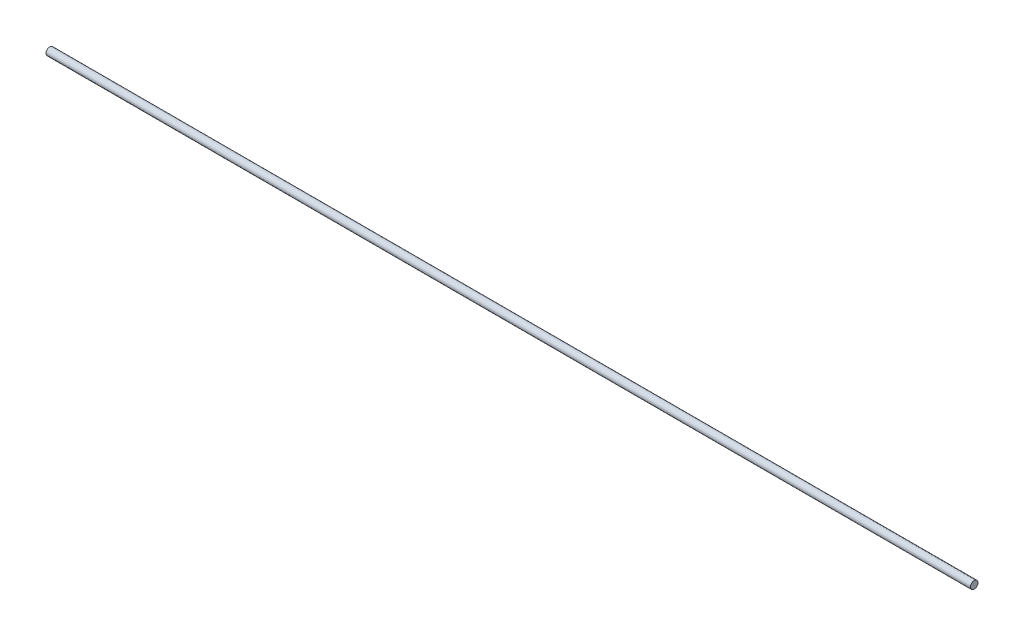
ISO-10303-21;
HEADER;
FILE_DESCRIPTION(('STEP AP214'),'2;1');
FILE_NAME('part.step','',(''),(''),'','','');
FILE_SCHEMA(('AUTOMOTIVE_DESIGN { 1 0 10303 214 1 1 1 1 }'));
ENDSEC;
DATA;
#1=APPLICATION_CONTEXT('core data for automotive mechanical design processes');
#2=APPLICATION_PROTOCOL_DEFINITION('international standard','automotive_design',2000,#1);
#3=PRODUCT_CONTEXT('',#1,'mechanical');
#4=PRODUCT('Part','Part','',(#3));
#5=PRODUCT_RELATED_PRODUCT_CATEGORY('part','',(#4));
#6=PRODUCT_DEFINITION_FORMATION('','',#4);
#7=PRODUCT_DEFINITION_CONTEXT('part definition',#1,'design');
#8=PRODUCT_DEFINITION('design','',#6,#7);
#9=PRODUCT_DEFINITION_SHAPE('','',#8);
#10=(LENGTH_UNIT() NAMED_UNIT(*) SI_UNIT(.MILLI.,.METRE.));
#11=(NAMED_UNIT(*) PLANE_ANGLE_UNIT() SI_UNIT($,.RADIAN.));
#12=(NAMED_UNIT(*) SI_UNIT($,.STERADIAN.) SOLID_ANGLE_UNIT());
#13=UNCERTAINTY_MEASURE_WITH_UNIT(LENGTH_MEASURE(1.E-05),#10,'distance_accuracy_value','');
#14=(GEOMETRIC_REPRESENTATION_CONTEXT(3) GLOBAL_UNCERTAINTY_ASSIGNED_CONTEXT((#13)) GLOBAL_UNIT_ASSIGNED_CONTEXT((#10,
#11,#12)) REPRESENTATION_CONTEXT('',''));
#15=CARTESIAN_POINT('',(0.,0.,0.));
#16=DIRECTION('',(0.,0.,1.));
#17=DIRECTION('',(1.,0.,0.));
#18=AXIS2_PLACEMENT_3D('',#15,#16,#17);
#19=CARTESIAN_POINT('',(183.5,57.,-179.));
#20=DIRECTION('',(-1.,0.,0.));
#21=DIRECTION('',(0.,0.,1.));
#22=AXIS2_PLACEMENT_3D('',#19,#20,#21);
#23=CYLINDRICAL_SURFACE('',#22,1.5);
#24=CARTESIAN_POINT('',(183.5,57.,-179.));
#25=DIRECTION('',(1.,0.,0.));
#26=DIRECTION('',(0.,0.,-1.));
#27=AXIS2_PLACEMENT_3D('',#24,#25,#26);
#28=CIRCLE('',#27,1.5);
#29=CARTESIAN_POINT('',(183.5,57.,-180.5));
#30=VERTEX_POINT('',#29);
#31=EDGE_CURVE('E10',#30,#30,#28,.T.);
#32=ORIENTED_EDGE('',*,*,#31,.F.);
#33=EDGE_LOOP('',(#32));
#34=FACE_BOUND('',#33,.T.);
#35=CARTESIAN_POINT('',(-183.5,57.,-179.));
#36=DIRECTION('',(1.,0.,0.));
#37=DIRECTION('',(0.,0.,-1.));
#38=AXIS2_PLACEMENT_3D('',#35,#36,#37);
#39=CIRCLE('',#38,1.5);
#40=CARTESIAN_POINT('',(-183.5,57.,-180.5));
#41=VERTEX_POINT('',#40);
#42=EDGE_CURVE('E38',#41,#41,#39,.T.);
#43=ORIENTED_EDGE('',*,*,#42,.T.);
#44=EDGE_LOOP('',(#43));
#45=FACE_BOUND('',#44,.T.);
#46=ADVANCED_FACE('F35',(#34,#45),#23,.T.);
#47=CARTESIAN_POINT('',(183.5,57.,-179.));
#48=DIRECTION('',(1.,0.,0.));
#49=DIRECTION('',(0.,0.,-1.));
#50=AXIS2_PLACEMENT_3D('',#47,#48,#49);
#51=PLANE('',#50);
#52=ORIENTED_EDGE('',*,*,#31,.T.);
#53=EDGE_LOOP('',(#52));
#54=FACE_BOUND('',#53,.T.);
#55=ADVANCED_FACE('F50',(#54),#51,.T.);
#56=CARTESIAN_POINT('',(-183.5,57.,-179.));
#57=DIRECTION('',(1.,0.,0.));
#58=DIRECTION('',(0.,0.,-1.));
#59=AXIS2_PLACEMENT_3D('',#56,#57,#58);
#60=PLANE('',#59);
#61=ORIENTED_EDGE('',*,*,#42,.F.);
#62=EDGE_LOOP('',(#61));
#63=FACE_BOUND('',#62,.T.);
#64=ADVANCED_FACE('F48',(#63),#60,.F.);
#65=CLOSED_SHELL('',(#46,#55,#64));
#66=MANIFOLD_SOLID_BREP('B2',#65);
#67=ADVANCED_BREP_SHAPE_REPRESENTATION('',(#18,#66),#14);
#68=SHAPE_DEFINITION_REPRESENTATION(#9,#67);
ENDSEC;
END-ISO-10303-21;
